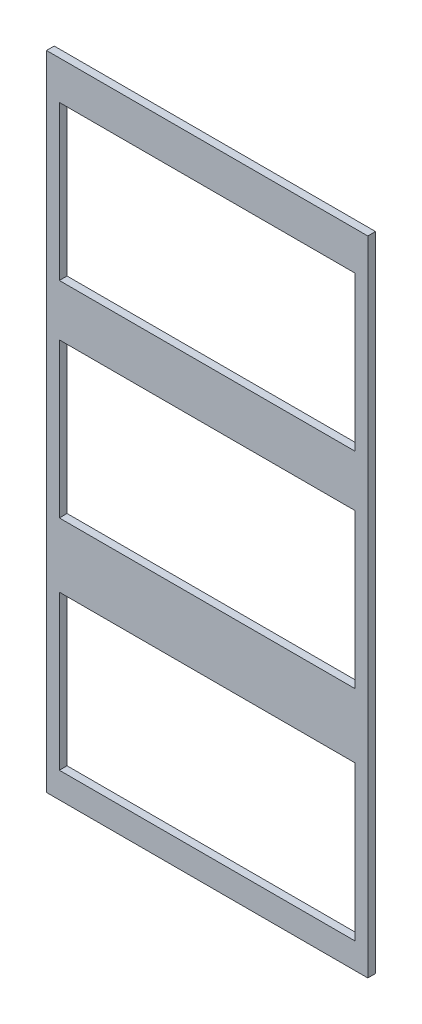
ISO-10303-21;
HEADER;
FILE_DESCRIPTION(('STEP AP214'),'2;1');
FILE_NAME('part.step','',(''),(''),'','','');
FILE_SCHEMA(('AUTOMOTIVE_DESIGN { 1 0 10303 214 1 1 1 1 }'));
ENDSEC;
DATA;
#1=APPLICATION_CONTEXT('core data for automotive mechanical design processes');
#2=APPLICATION_PROTOCOL_DEFINITION('international standard','automotive_design',2000,#1);
#3=PRODUCT_CONTEXT('',#1,'mechanical');
#4=PRODUCT('Part','Part','',(#3));
#5=PRODUCT_RELATED_PRODUCT_CATEGORY('part','',(#4));
#6=PRODUCT_DEFINITION_FORMATION('','',#4);
#7=PRODUCT_DEFINITION_CONTEXT('part definition',#1,'design');
#8=PRODUCT_DEFINITION('design','',#6,#7);
#9=PRODUCT_DEFINITION_SHAPE('','',#8);
#10=(LENGTH_UNIT() NAMED_UNIT(*) SI_UNIT(.MILLI.,.METRE.));
#11=(NAMED_UNIT(*) PLANE_ANGLE_UNIT() SI_UNIT($,.RADIAN.));
#12=(NAMED_UNIT(*) SI_UNIT($,.STERADIAN.) SOLID_ANGLE_UNIT());
#13=UNCERTAINTY_MEASURE_WITH_UNIT(LENGTH_MEASURE(1.E-05),#10,'distance_accuracy_value','');
#14=(GEOMETRIC_REPRESENTATION_CONTEXT(3) GLOBAL_UNCERTAINTY_ASSIGNED_CONTEXT((#13)) GLOBAL_UNIT_ASSIGNED_CONTEXT((#10,
#11,#12)) REPRESENTATION_CONTEXT('',''));
#15=CARTESIAN_POINT('',(0.,0.,0.));
#16=DIRECTION('',(0.,0.,1.));
#17=DIRECTION('',(1.,0.,0.));
#18=AXIS2_PLACEMENT_3D('',#15,#16,#17);
#19=CARTESIAN_POINT('',(0.,0.,6.));
#20=DIRECTION('',(0.,0.,1.));
#21=DIRECTION('',(1.,0.,0.));
#22=AXIS2_PLACEMENT_3D('',#19,#20,#21);
#23=PLANE('',#22);
#24=DIRECTION('',(0.,-1.,0.));
#25=VECTOR('',#24,1.);
#26=CARTESIAN_POINT('',(0.,0.,6.));
#27=LINE('',#26,#25);
#28=CARTESIAN_POINT('',(0.,0.,6.));
#29=VERTEX_POINT('',#28);
#30=CARTESIAN_POINT('',(0.,-500.,6.));
#31=VERTEX_POINT('',#30);
#32=EDGE_CURVE('E293',#29,#31,#27,.T.);
#33=ORIENTED_EDGE('',*,*,#32,.T.);
#34=DIRECTION('',(1.,0.,0.));
#35=VECTOR('',#34,1.);
#36=CARTESIAN_POINT('',(0.,-500.,6.));
#37=LINE('',#36,#35);
#38=CARTESIAN_POINT('',(250.,-500.,6.));
#39=VERTEX_POINT('',#38);
#40=EDGE_CURVE('E297',#31,#39,#37,.T.);
#41=ORIENTED_EDGE('',*,*,#40,.T.);
#42=DIRECTION('',(0.,1.,0.));
#43=VECTOR('',#42,1.);
#44=CARTESIAN_POINT('',(250.,0.,6.));
#45=LINE('',#44,#43);
#46=CARTESIAN_POINT('',(250.,0.,6.));
#47=VERTEX_POINT('',#46);
#48=EDGE_CURVE('E301',#39,#47,#45,.T.);
#49=ORIENTED_EDGE('',*,*,#48,.T.);
#50=DIRECTION('',(-1.,0.,0.));
#51=VECTOR('',#50,1.);
#52=CARTESIAN_POINT('',(0.,0.,6.));
#53=LINE('',#52,#51);
#54=EDGE_CURVE('E304',#47,#29,#53,.T.);
#55=ORIENTED_EDGE('',*,*,#54,.T.);
#56=EDGE_LOOP('',(#33,#41,#49,#55));
#57=FACE_BOUND('',#56,.T.);
#58=DIRECTION('',(-1.,0.,0.));
#59=VECTOR('',#58,1.);
#60=CARTESIAN_POINT('',(0.,-480.,6.));
#61=LINE('',#60,#59);
#62=CARTESIAN_POINT('',(240.,-480.,6.));
#63=VERTEX_POINT('',#62);
#64=CARTESIAN_POINT('',(9.99999999999996,-480.,6.));
#65=VERTEX_POINT('',#64);
#66=EDGE_CURVE('E262',#63,#65,#61,.T.);
#67=ORIENTED_EDGE('',*,*,#66,.T.);
#68=DIRECTION('',(0.,-1.,0.));
#69=VECTOR('',#68,1.);
#70=CARTESIAN_POINT('',(10.,0.,6.));
#71=LINE('',#70,#69);
#72=CARTESIAN_POINT('',(9.99999999999998,-360.,6.));
#73=VERTEX_POINT('',#72);
#74=EDGE_CURVE('E251',#73,#65,#71,.T.);
#75=ORIENTED_EDGE('',*,*,#74,.F.);
#76=DIRECTION('',(-1.,0.,0.));
#77=VECTOR('',#76,1.);
#78=CARTESIAN_POINT('',(0.,-360.,6.));
#79=LINE('',#78,#77);
#80=CARTESIAN_POINT('',(240.,-360.,6.));
#81=VERTEX_POINT('',#80);
#82=EDGE_CURVE('E254',#81,#73,#79,.T.);
#83=ORIENTED_EDGE('',*,*,#82,.F.);
#84=DIRECTION('',(0.,-1.,0.));
#85=VECTOR('',#84,1.);
#86=CARTESIAN_POINT('',(240.,0.,6.));
#87=LINE('',#86,#85);
#88=EDGE_CURVE('E258',#81,#63,#87,.T.);
#89=ORIENTED_EDGE('',*,*,#88,.T.);
#90=EDGE_LOOP('',(#67,#75,#83,#89));
#91=FACE_BOUND('',#90,.T.);
#92=DIRECTION('',(-1.,0.,0.));
#93=VECTOR('',#92,1.);
#94=CARTESIAN_POINT('',(0.,-310.,6.));
#95=LINE('',#94,#93);
#96=CARTESIAN_POINT('',(240.,-310.,6.));
#97=VERTEX_POINT('',#96);
#98=CARTESIAN_POINT('',(9.99999999999996,-310.,6.));
#99=VERTEX_POINT('',#98);
#100=EDGE_CURVE('E219',#97,#99,#95,.T.);
#101=ORIENTED_EDGE('',*,*,#100,.T.);
#102=DIRECTION('',(0.,-1.,0.));
#103=VECTOR('',#102,1.);
#104=CARTESIAN_POINT('',(10.,0.,6.));
#105=LINE('',#104,#103);
#106=CARTESIAN_POINT('',(9.99999999999998,-190.,6.));
#107=VERTEX_POINT('',#106);
#108=EDGE_CURVE('E210',#107,#99,#105,.T.);
#109=ORIENTED_EDGE('',*,*,#108,.F.);
#110=DIRECTION('',(-1.,0.,0.));
#111=VECTOR('',#110,1.);
#112=CARTESIAN_POINT('',(0.,-190.,6.));
#113=LINE('',#112,#111);
#114=CARTESIAN_POINT('',(240.,-190.,6.));
#115=VERTEX_POINT('',#114);
#116=EDGE_CURVE('E213',#115,#107,#113,.T.);
#117=ORIENTED_EDGE('',*,*,#116,.F.);
#118=DIRECTION('',(0.,-1.,0.));
#119=VECTOR('',#118,1.);
#120=CARTESIAN_POINT('',(240.,0.,6.));
#121=LINE('',#120,#119);
#122=EDGE_CURVE('E68',#115,#97,#121,.T.);
#123=ORIENTED_EDGE('',*,*,#122,.T.);
#124=EDGE_LOOP('',(#101,#109,#117,#123));
#125=FACE_BOUND('',#124,.T.);
#126=DIRECTION('',(-1.,0.,0.));
#127=VECTOR('',#126,1.);
#128=CARTESIAN_POINT('',(0.,-150.,6.));
#129=LINE('',#128,#127);
#130=CARTESIAN_POINT('',(240.,-150.,6.));
#131=VERTEX_POINT('',#130);
#132=CARTESIAN_POINT('',(9.99999999999998,-150.,6.));
#133=VERTEX_POINT('',#132);
#134=EDGE_CURVE('E176',#131,#133,#129,.T.);
#135=ORIENTED_EDGE('',*,*,#134,.T.);
#136=DIRECTION('',(0.,-1.,0.));
#137=VECTOR('',#136,1.);
#138=CARTESIAN_POINT('',(10.,0.,6.));
#139=LINE('',#138,#137);
#140=CARTESIAN_POINT('',(10.,-30.,6.));
#141=VERTEX_POINT('',#140);
#142=EDGE_CURVE('E168',#141,#133,#139,.T.);
#143=ORIENTED_EDGE('',*,*,#142,.F.);
#144=DIRECTION('',(-1.,0.,0.));
#145=VECTOR('',#144,1.);
#146=CARTESIAN_POINT('',(0.,-30.,6.));
#147=LINE('',#146,#145);
#148=CARTESIAN_POINT('',(240.,-30.,6.));
#149=VERTEX_POINT('',#148);
#150=EDGE_CURVE('E158',#149,#141,#147,.T.);
#151=ORIENTED_EDGE('',*,*,#150,.F.);
#152=DIRECTION('',(0.,-1.,0.));
#153=VECTOR('',#152,1.);
#154=CARTESIAN_POINT('',(240.,0.,6.));
#155=LINE('',#154,#153);
#156=EDGE_CURVE('E60',#149,#131,#155,.T.);
#157=ORIENTED_EDGE('',*,*,#156,.T.);
#158=EDGE_LOOP('',(#135,#143,#151,#157));
#159=FACE_BOUND('',#158,.T.);
#160=ADVANCED_FACE('F44',(#57,#91,#125,#159),#23,.T.);
#161=CARTESIAN_POINT('',(0.,0.,0.));
#162=DIRECTION('',(0.,0.,1.));
#163=DIRECTION('',(1.,0.,0.));
#164=AXIS2_PLACEMENT_3D('',#161,#162,#163);
#165=PLANE('',#164);
#166=DIRECTION('',(0.,-1.,0.));
#167=VECTOR('',#166,1.);
#168=CARTESIAN_POINT('',(10.,0.,0.));
#169=LINE('',#168,#167);
#170=CARTESIAN_POINT('',(9.99999999999998,-190.,0.));
#171=VERTEX_POINT('',#170);
#172=CARTESIAN_POINT('',(9.99999999999996,-310.,0.));
#173=VERTEX_POINT('',#172);
#174=EDGE_CURVE('E224',#171,#173,#169,.T.);
#175=ORIENTED_EDGE('',*,*,#174,.T.);
#176=DIRECTION('',(-1.,0.,0.));
#177=VECTOR('',#176,1.);
#178=CARTESIAN_POINT('',(0.,-310.,0.));
#179=LINE('',#178,#177);
#180=CARTESIAN_POINT('',(240.,-310.,0.));
#181=VERTEX_POINT('',#180);
#182=EDGE_CURVE('E214',#181,#173,#179,.T.);
#183=ORIENTED_EDGE('',*,*,#182,.F.);
#184=DIRECTION('',(0.,-1.,0.));
#185=VECTOR('',#184,1.);
#186=CARTESIAN_POINT('',(240.,0.,0.));
#187=LINE('',#186,#185);
#188=CARTESIAN_POINT('',(240.,-190.,0.));
#189=VERTEX_POINT('',#188);
#190=EDGE_CURVE('E233',#189,#181,#187,.T.);
#191=ORIENTED_EDGE('',*,*,#190,.F.);
#192=DIRECTION('',(-1.,0.,0.));
#193=VECTOR('',#192,1.);
#194=CARTESIAN_POINT('',(0.,-190.,0.));
#195=LINE('',#194,#193);
#196=EDGE_CURVE('E228',#189,#171,#195,.T.);
#197=ORIENTED_EDGE('',*,*,#196,.T.);
#198=EDGE_LOOP('',(#175,#183,#191,#197));
#199=FACE_BOUND('',#198,.T.);
#200=DIRECTION('',(0.,-1.,0.));
#201=VECTOR('',#200,1.);
#202=CARTESIAN_POINT('',(0.,0.,0.));
#203=LINE('',#202,#201);
#204=CARTESIAN_POINT('',(0.,0.,0.));
#205=VERTEX_POINT('',#204);
#206=CARTESIAN_POINT('',(0.,-500.,0.));
#207=VERTEX_POINT('',#206);
#208=EDGE_CURVE('E204',#205,#207,#203,.T.);
#209=ORIENTED_EDGE('',*,*,#208,.F.);
#210=DIRECTION('',(-1.,0.,0.));
#211=VECTOR('',#210,1.);
#212=CARTESIAN_POINT('',(0.,0.,0.));
#213=LINE('',#212,#211);
#214=CARTESIAN_POINT('',(250.,0.,0.));
#215=VERTEX_POINT('',#214);
#216=EDGE_CURVE('E298',#215,#205,#213,.T.);
#217=ORIENTED_EDGE('',*,*,#216,.F.);
#218=DIRECTION('',(0.,1.,0.));
#219=VECTOR('',#218,1.);
#220=CARTESIAN_POINT('',(250.,0.,0.));
#221=LINE('',#220,#219);
#222=CARTESIAN_POINT('',(250.,-500.,0.));
#223=VERTEX_POINT('',#222);
#224=EDGE_CURVE('E314',#223,#215,#221,.T.);
#225=ORIENTED_EDGE('',*,*,#224,.F.);
#226=DIRECTION('',(1.,0.,0.));
#227=VECTOR('',#226,1.);
#228=CARTESIAN_POINT('',(0.,-500.,0.));
#229=LINE('',#228,#227);
#230=EDGE_CURVE('E311',#207,#223,#229,.T.);
#231=ORIENTED_EDGE('',*,*,#230,.F.);
#232=EDGE_LOOP('',(#209,#217,#225,#231));
#233=FACE_BOUND('',#232,.T.);
#234=DIRECTION('',(0.,-1.,0.));
#235=VECTOR('',#234,1.);
#236=CARTESIAN_POINT('',(10.,0.,0.));
#237=LINE('',#236,#235);
#238=CARTESIAN_POINT('',(9.99999999999998,-360.,0.));
#239=VERTEX_POINT('',#238);
#240=CARTESIAN_POINT('',(9.99999999999996,-480.,0.));
#241=VERTEX_POINT('',#240);
#242=EDGE_CURVE('E267',#239,#241,#237,.T.);
#243=ORIENTED_EDGE('',*,*,#242,.T.);
#244=DIRECTION('',(-1.,0.,0.));
#245=VECTOR('',#244,1.);
#246=CARTESIAN_POINT('',(0.,-480.,0.));
#247=LINE('',#246,#245);
#248=CARTESIAN_POINT('',(240.,-480.,0.));
#249=VERTEX_POINT('',#248);
#250=EDGE_CURVE('E255',#249,#241,#247,.T.);
#251=ORIENTED_EDGE('',*,*,#250,.F.);
#252=DIRECTION('',(0.,-1.,0.));
#253=VECTOR('',#252,1.);
#254=CARTESIAN_POINT('',(240.,0.,0.));
#255=LINE('',#254,#253);
#256=CARTESIAN_POINT('',(240.,-360.,0.));
#257=VERTEX_POINT('',#256);
#258=EDGE_CURVE('E275',#257,#249,#255,.T.);
#259=ORIENTED_EDGE('',*,*,#258,.F.);
#260=DIRECTION('',(-1.,0.,0.));
#261=VECTOR('',#260,1.);
#262=CARTESIAN_POINT('',(0.,-360.,0.));
#263=LINE('',#262,#261);
#264=EDGE_CURVE('E271',#257,#239,#263,.T.);
#265=ORIENTED_EDGE('',*,*,#264,.T.);
#266=EDGE_LOOP('',(#243,#251,#259,#265));
#267=FACE_BOUND('',#266,.T.);
#268=DIRECTION('',(0.,-1.,0.));
#269=VECTOR('',#268,1.);
#270=CARTESIAN_POINT('',(10.,0.,0.));
#271=LINE('',#270,#269);
#272=CARTESIAN_POINT('',(10.,-30.,0.));
#273=VERTEX_POINT('',#272);
#274=CARTESIAN_POINT('',(9.99999999999998,-150.,0.));
#275=VERTEX_POINT('',#274);
#276=EDGE_CURVE('E174',#273,#275,#271,.T.);
#277=ORIENTED_EDGE('',*,*,#276,.T.);
#278=DIRECTION('',(-1.,0.,0.));
#279=VECTOR('',#278,1.);
#280=CARTESIAN_POINT('',(0.,-150.,0.));
#281=LINE('',#280,#279);
#282=CARTESIAN_POINT('',(240.,-150.,0.));
#283=VERTEX_POINT('',#282);
#284=EDGE_CURVE('E181',#283,#275,#281,.T.);
#285=ORIENTED_EDGE('',*,*,#284,.F.);
#286=DIRECTION('',(0.,-1.,0.));
#287=VECTOR('',#286,1.);
#288=CARTESIAN_POINT('',(240.,0.,0.));
#289=LINE('',#288,#287);
#290=CARTESIAN_POINT('',(240.,-30.,0.));
#291=VERTEX_POINT('',#290);
#292=EDGE_CURVE('E185',#291,#283,#289,.T.);
#293=ORIENTED_EDGE('',*,*,#292,.F.);
#294=DIRECTION('',(-1.,0.,0.));
#295=VECTOR('',#294,1.);
#296=CARTESIAN_POINT('',(0.,-30.,0.));
#297=LINE('',#296,#295);
#298=EDGE_CURVE('E194',#291,#273,#297,.T.);
#299=ORIENTED_EDGE('',*,*,#298,.T.);
#300=EDGE_LOOP('',(#277,#285,#293,#299));
#301=FACE_BOUND('',#300,.T.);
#302=ADVANCED_FACE('F337',(#199,#233,#267,#301),#165,.F.);
#303=CARTESIAN_POINT('',(0.,0.,6.));
#304=DIRECTION('',(1.,0.,0.));
#305=DIRECTION('',(0.,1.,0.));
#306=AXIS2_PLACEMENT_3D('',#303,#304,#305);
#307=PLANE('',#306);
#308=ORIENTED_EDGE('',*,*,#208,.T.);
#309=DIRECTION('',(0.,0.,-1.));
#310=VECTOR('',#309,1.);
#311=CARTESIAN_POINT('',(0.,-500.,6.));
#312=LINE('',#311,#310);
#313=EDGE_CURVE('E11',#31,#207,#312,.T.);
#314=ORIENTED_EDGE('',*,*,#313,.F.);
#315=ORIENTED_EDGE('',*,*,#32,.F.);
#316=DIRECTION('',(0.,0.,-1.));
#317=VECTOR('',#316,1.);
#318=CARTESIAN_POINT('',(0.,0.,6.));
#319=LINE('',#318,#317);
#320=EDGE_CURVE('E307',#29,#205,#319,.T.);
#321=ORIENTED_EDGE('',*,*,#320,.T.);
#322=EDGE_LOOP('',(#308,#314,#315,#321));
#323=FACE_BOUND('',#322,.T.);
#324=ADVANCED_FACE('F46',(#323),#307,.F.);
#325=CARTESIAN_POINT('',(0.,-500.,6.));
#326=DIRECTION('',(0.,1.,0.));
#327=DIRECTION('',(0.,0.,1.));
#328=AXIS2_PLACEMENT_3D('',#325,#326,#327);
#329=PLANE('',#328);
#330=ORIENTED_EDGE('',*,*,#230,.T.);
#331=DIRECTION('',(0.,0.,-1.));
#332=VECTOR('',#331,1.);
#333=CARTESIAN_POINT('',(250.,-500.,6.));
#334=LINE('',#333,#332);
#335=EDGE_CURVE('E53',#39,#223,#334,.T.);
#336=ORIENTED_EDGE('',*,*,#335,.F.);
#337=ORIENTED_EDGE('',*,*,#40,.F.);
#338=ORIENTED_EDGE('',*,*,#313,.T.);
#339=EDGE_LOOP('',(#330,#336,#337,#338));
#340=FACE_BOUND('',#339,.T.);
#341=ADVANCED_FACE('F348',(#340),#329,.F.);
#342=CARTESIAN_POINT('',(250.,0.,6.));
#343=DIRECTION('',(-1.,0.,0.));
#344=DIRECTION('',(0.,-1.,0.));
#345=AXIS2_PLACEMENT_3D('',#342,#343,#344);
#346=PLANE('',#345);
#347=ORIENTED_EDGE('',*,*,#224,.T.);
#348=DIRECTION('',(0.,0.,-1.));
#349=VECTOR('',#348,1.);
#350=CARTESIAN_POINT('',(250.,0.,6.));
#351=LINE('',#350,#349);
#352=EDGE_CURVE('E322',#47,#215,#351,.T.);
#353=ORIENTED_EDGE('',*,*,#352,.F.);
#354=ORIENTED_EDGE('',*,*,#48,.F.);
#355=ORIENTED_EDGE('',*,*,#335,.T.);
#356=EDGE_LOOP('',(#347,#353,#354,#355));
#357=FACE_BOUND('',#356,.T.);
#358=ADVANCED_FACE('F331',(#357),#346,.F.);
#359=CARTESIAN_POINT('',(0.,0.,6.));
#360=DIRECTION('',(0.,-1.,0.));
#361=DIRECTION('',(0.,0.,-1.));
#362=AXIS2_PLACEMENT_3D('',#359,#360,#361);
#363=PLANE('',#362);
#364=ORIENTED_EDGE('',*,*,#216,.T.);
#365=ORIENTED_EDGE('',*,*,#320,.F.);
#366=ORIENTED_EDGE('',*,*,#54,.F.);
#367=ORIENTED_EDGE('',*,*,#352,.T.);
#368=EDGE_LOOP('',(#364,#365,#366,#367));
#369=FACE_BOUND('',#368,.T.);
#370=ADVANCED_FACE('F341',(#369),#363,.F.);
#371=CARTESIAN_POINT('',(10.,0.,6.));
#372=DIRECTION('',(1.,0.,0.));
#373=DIRECTION('',(0.,1.,0.));
#374=AXIS2_PLACEMENT_3D('',#371,#372,#373);
#375=PLANE('',#374);
#376=ORIENTED_EDGE('',*,*,#242,.F.);
#377=DIRECTION('',(0.,0.,-1.));
#378=VECTOR('',#377,1.);
#379=CARTESIAN_POINT('',(9.99999999999998,-360.,6.));
#380=LINE('',#379,#378);
#381=EDGE_CURVE('E266',#73,#239,#380,.T.);
#382=ORIENTED_EDGE('',*,*,#381,.F.);
#383=ORIENTED_EDGE('',*,*,#74,.T.);
#384=DIRECTION('',(0.,0.,-1.));
#385=VECTOR('',#384,1.);
#386=CARTESIAN_POINT('',(9.99999999999996,-480.,6.));
#387=LINE('',#386,#385);
#388=EDGE_CURVE('E229',#65,#241,#387,.T.);
#389=ORIENTED_EDGE('',*,*,#388,.T.);
#390=EDGE_LOOP('',(#376,#382,#383,#389));
#391=FACE_BOUND('',#390,.T.);
#392=ADVANCED_FACE('F364',(#391),#375,.T.);
#393=CARTESIAN_POINT('',(0.,-480.,6.));
#394=DIRECTION('',(0.,-1.,0.));
#395=DIRECTION('',(0.,0.,-1.));
#396=AXIS2_PLACEMENT_3D('',#393,#394,#395);
#397=PLANE('',#396);
#398=ORIENTED_EDGE('',*,*,#250,.T.);
#399=ORIENTED_EDGE('',*,*,#388,.F.);
#400=ORIENTED_EDGE('',*,*,#66,.F.);
#401=DIRECTION('',(0.,0.,-1.));
#402=VECTOR('',#401,1.);
#403=CARTESIAN_POINT('',(240.,-480.,6.));
#404=LINE('',#403,#402);
#405=EDGE_CURVE('E284',#63,#249,#404,.T.);
#406=ORIENTED_EDGE('',*,*,#405,.T.);
#407=EDGE_LOOP('',(#398,#399,#400,#406));
#408=FACE_BOUND('',#407,.T.);
#409=ADVANCED_FACE('F372',(#408),#397,.F.);
#410=CARTESIAN_POINT('',(240.,0.,6.));
#411=DIRECTION('',(1.,0.,0.));
#412=DIRECTION('',(0.,0.,-1.));
#413=AXIS2_PLACEMENT_3D('',#410,#411,#412);
#414=PLANE('',#413);
#415=ORIENTED_EDGE('',*,*,#258,.T.);
#416=ORIENTED_EDGE('',*,*,#405,.F.);
#417=ORIENTED_EDGE('',*,*,#88,.F.);
#418=DIRECTION('',(0.,0.,-1.));
#419=VECTOR('',#418,1.);
#420=CARTESIAN_POINT('',(240.,-360.,6.));
#421=LINE('',#420,#419);
#422=EDGE_CURVE('E287',#81,#257,#421,.T.);
#423=ORIENTED_EDGE('',*,*,#422,.T.);
#424=EDGE_LOOP('',(#415,#416,#417,#423));
#425=FACE_BOUND('',#424,.T.);
#426=ADVANCED_FACE('F378',(#425),#414,.F.);
#427=CARTESIAN_POINT('',(0.,-360.,6.));
#428=DIRECTION('',(0.,-1.,0.));
#429=DIRECTION('',(0.,0.,-1.));
#430=AXIS2_PLACEMENT_3D('',#427,#428,#429);
#431=PLANE('',#430);
#432=ORIENTED_EDGE('',*,*,#264,.F.);
#433=ORIENTED_EDGE('',*,*,#422,.F.);
#434=ORIENTED_EDGE('',*,*,#82,.T.);
#435=ORIENTED_EDGE('',*,*,#381,.T.);
#436=EDGE_LOOP('',(#432,#433,#434,#435));
#437=FACE_BOUND('',#436,.T.);
#438=ADVANCED_FACE('F387',(#437),#431,.T.);
#439=CARTESIAN_POINT('',(10.,0.,6.));
#440=DIRECTION('',(1.,0.,0.));
#441=DIRECTION('',(0.,1.,0.));
#442=AXIS2_PLACEMENT_3D('',#439,#440,#441);
#443=PLANE('',#442);
#444=ORIENTED_EDGE('',*,*,#174,.F.);
#445=DIRECTION('',(0.,0.,-1.));
#446=VECTOR('',#445,1.);
#447=CARTESIAN_POINT('',(9.99999999999998,-190.,6.));
#448=LINE('',#447,#446);
#449=EDGE_CURVE('E223',#107,#171,#448,.T.);
#450=ORIENTED_EDGE('',*,*,#449,.F.);
#451=ORIENTED_EDGE('',*,*,#108,.T.);
#452=DIRECTION('',(0.,0.,-1.));
#453=VECTOR('',#452,1.);
#454=CARTESIAN_POINT('',(9.99999999999996,-310.,6.));
#455=LINE('',#454,#453);
#456=EDGE_CURVE('E195',#99,#173,#455,.T.);
#457=ORIENTED_EDGE('',*,*,#456,.T.);
#458=EDGE_LOOP('',(#444,#450,#451,#457));
#459=FACE_BOUND('',#458,.T.);
#460=ADVANCED_FACE('F403',(#459),#443,.T.);
#461=CARTESIAN_POINT('',(0.,-310.,6.));
#462=DIRECTION('',(0.,-1.,0.));
#463=DIRECTION('',(0.,0.,-1.));
#464=AXIS2_PLACEMENT_3D('',#461,#462,#463);
#465=PLANE('',#464);
#466=ORIENTED_EDGE('',*,*,#182,.T.);
#467=ORIENTED_EDGE('',*,*,#456,.F.);
#468=ORIENTED_EDGE('',*,*,#100,.F.);
#469=DIRECTION('',(0.,0.,-1.));
#470=VECTOR('',#469,1.);
#471=CARTESIAN_POINT('',(240.,-310.,6.));
#472=LINE('',#471,#470);
#473=EDGE_CURVE('E242',#97,#181,#472,.T.);
#474=ORIENTED_EDGE('',*,*,#473,.T.);
#475=EDGE_LOOP('',(#466,#467,#468,#474));
#476=FACE_BOUND('',#475,.T.);
#477=ADVANCED_FACE('F400',(#476),#465,.F.);
#478=CARTESIAN_POINT('',(240.,0.,6.));
#479=DIRECTION('',(1.,0.,0.));
#480=DIRECTION('',(0.,0.,-1.));
#481=AXIS2_PLACEMENT_3D('',#478,#479,#480);
#482=PLANE('',#481);
#483=ORIENTED_EDGE('',*,*,#190,.T.);
#484=ORIENTED_EDGE('',*,*,#473,.F.);
#485=ORIENTED_EDGE('',*,*,#122,.F.);
#486=DIRECTION('',(0.,0.,-1.));
#487=VECTOR('',#486,1.);
#488=CARTESIAN_POINT('',(240.,-190.,6.));
#489=LINE('',#488,#487);
#490=EDGE_CURVE('E245',#115,#189,#489,.T.);
#491=ORIENTED_EDGE('',*,*,#490,.T.);
#492=EDGE_LOOP('',(#483,#484,#485,#491));
#493=FACE_BOUND('',#492,.T.);
#494=ADVANCED_FACE('F409',(#493),#482,.F.);
#495=CARTESIAN_POINT('',(0.,-190.,6.));
#496=DIRECTION('',(0.,-1.,0.));
#497=DIRECTION('',(0.,0.,-1.));
#498=AXIS2_PLACEMENT_3D('',#495,#496,#497);
#499=PLANE('',#498);
#500=ORIENTED_EDGE('',*,*,#196,.F.);
#501=ORIENTED_EDGE('',*,*,#490,.F.);
#502=ORIENTED_EDGE('',*,*,#116,.T.);
#503=ORIENTED_EDGE('',*,*,#449,.T.);
#504=EDGE_LOOP('',(#500,#501,#502,#503));
#505=FACE_BOUND('',#504,.T.);
#506=ADVANCED_FACE('F407',(#505),#499,.T.);
#507=CARTESIAN_POINT('',(10.,0.,6.));
#508=DIRECTION('',(1.,0.,0.));
#509=DIRECTION('',(0.,1.,0.));
#510=AXIS2_PLACEMENT_3D('',#507,#508,#509);
#511=PLANE('',#510);
#512=ORIENTED_EDGE('',*,*,#276,.F.);
#513=DIRECTION('',(0.,0.,-1.));
#514=VECTOR('',#513,1.);
#515=CARTESIAN_POINT('',(10.,-30.,6.));
#516=LINE('',#515,#514);
#517=EDGE_CURVE('E162',#141,#273,#516,.T.);
#518=ORIENTED_EDGE('',*,*,#517,.F.);
#519=ORIENTED_EDGE('',*,*,#142,.T.);
#520=DIRECTION('',(0.,0.,-1.));
#521=VECTOR('',#520,1.);
#522=CARTESIAN_POINT('',(9.99999999999998,-150.,6.));
#523=LINE('',#522,#521);
#524=EDGE_CURVE('E201',#133,#275,#523,.T.);
#525=ORIENTED_EDGE('',*,*,#524,.T.);
#526=EDGE_LOOP('',(#512,#518,#519,#525));
#527=FACE_BOUND('',#526,.T.);
#528=ADVANCED_FACE('F171',(#527),#511,.T.);
#529=CARTESIAN_POINT('',(0.,-150.,6.));
#530=DIRECTION('',(0.,-1.,0.));
#531=DIRECTION('',(0.,0.,-1.));
#532=AXIS2_PLACEMENT_3D('',#529,#530,#531);
#533=PLANE('',#532);
#534=ORIENTED_EDGE('',*,*,#284,.T.);
#535=ORIENTED_EDGE('',*,*,#524,.F.);
#536=ORIENTED_EDGE('',*,*,#134,.F.);
#537=DIRECTION('',(0.,0.,-1.));
#538=VECTOR('',#537,1.);
#539=CARTESIAN_POINT('',(240.,-150.,6.));
#540=LINE('',#539,#538);
#541=EDGE_CURVE('E205',#131,#283,#540,.T.);
#542=ORIENTED_EDGE('',*,*,#541,.T.);
#543=EDGE_LOOP('',(#534,#535,#536,#542));
#544=FACE_BOUND('',#543,.T.);
#545=ADVANCED_FACE('F455',(#544),#533,.F.);
#546=CARTESIAN_POINT('',(240.,0.,6.));
#547=DIRECTION('',(1.,0.,0.));
#548=DIRECTION('',(0.,1.,0.));
#549=AXIS2_PLACEMENT_3D('',#546,#547,#548);
#550=PLANE('',#549);
#551=ORIENTED_EDGE('',*,*,#292,.T.);
#552=ORIENTED_EDGE('',*,*,#541,.F.);
#553=ORIENTED_EDGE('',*,*,#156,.F.);
#554=DIRECTION('',(0.,0.,-1.));
#555=VECTOR('',#554,1.);
#556=CARTESIAN_POINT('',(240.,-30.,6.));
#557=LINE('',#556,#555);
#558=EDGE_CURVE('E164',#149,#291,#557,.T.);
#559=ORIENTED_EDGE('',*,*,#558,.T.);
#560=EDGE_LOOP('',(#551,#552,#553,#559));
#561=FACE_BOUND('',#560,.T.);
#562=ADVANCED_FACE('F463',(#561),#550,.F.);
#563=CARTESIAN_POINT('',(0.,-30.,6.));
#564=DIRECTION('',(0.,-1.,0.));
#565=DIRECTION('',(0.,0.,-1.));
#566=AXIS2_PLACEMENT_3D('',#563,#564,#565);
#567=PLANE('',#566);
#568=ORIENTED_EDGE('',*,*,#298,.F.);
#569=ORIENTED_EDGE('',*,*,#558,.F.);
#570=ORIENTED_EDGE('',*,*,#150,.T.);
#571=ORIENTED_EDGE('',*,*,#517,.T.);
#572=EDGE_LOOP('',(#568,#569,#570,#571));
#573=FACE_BOUND('',#572,.T.);
#574=ADVANCED_FACE('F161',(#573),#567,.T.);
#575=CLOSED_SHELL('',(#160,#302,#324,#341,#358,#370,#392,#409,#426,#438,#460,#477,#494,#506,
#528,#545,#562,#574));
#576=MANIFOLD_SOLID_BREP('B2',#575);
#577=ADVANCED_BREP_SHAPE_REPRESENTATION('',(#18,#576),#14);
#578=SHAPE_DEFINITION_REPRESENTATION(#9,#577);
ENDSEC;
END-ISO-10303-21;
